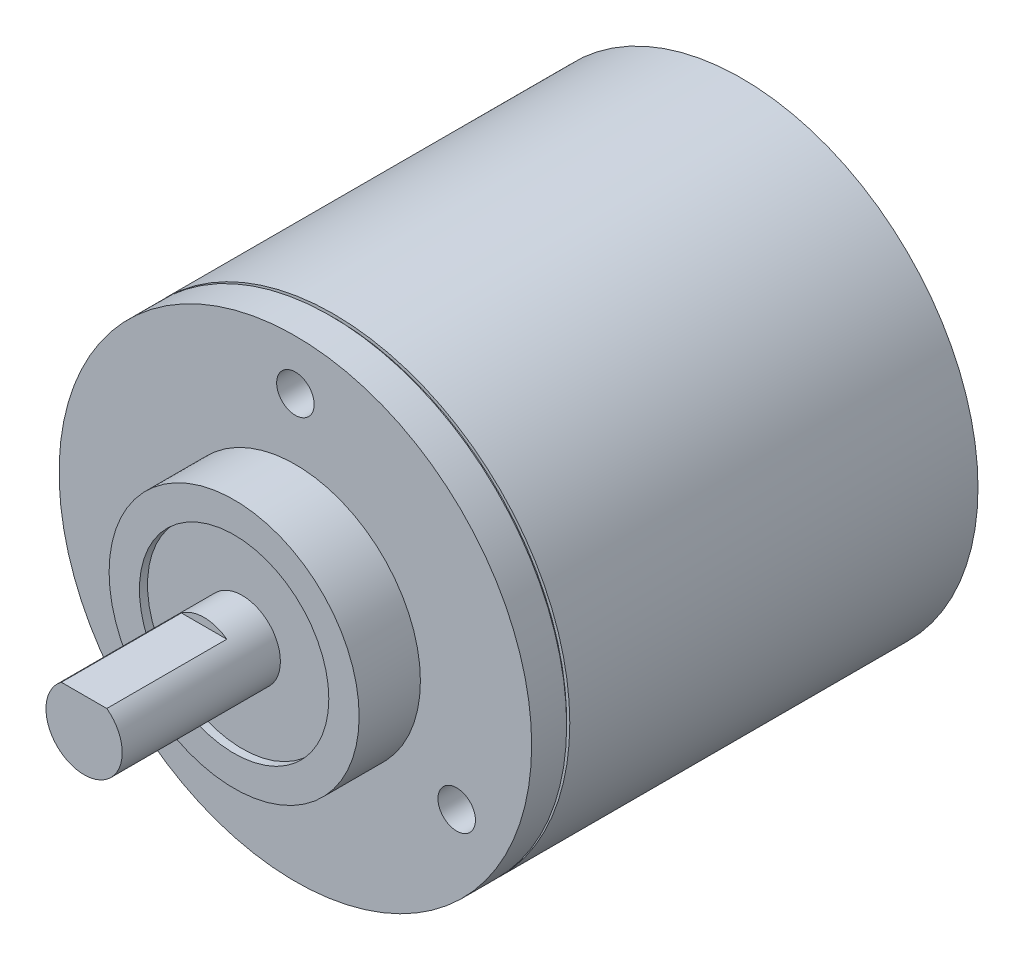
ISO-10303-21;
HEADER;
FILE_DESCRIPTION(('STEP AP214'),'2;1');
FILE_NAME('part.step','',(''),(''),'','','');
FILE_SCHEMA(('AUTOMOTIVE_DESIGN { 1 0 10303 214 1 1 1 1 }'));
ENDSEC;
DATA;
#1=APPLICATION_CONTEXT('core data for automotive mechanical design processes');
#2=APPLICATION_PROTOCOL_DEFINITION('international standard','automotive_design',2000,#1);
#3=PRODUCT_CONTEXT('',#1,'mechanical');
#4=PRODUCT('Part','Part','',(#3));
#5=PRODUCT_RELATED_PRODUCT_CATEGORY('part','',(#4));
#6=PRODUCT_DEFINITION_FORMATION('','',#4);
#7=PRODUCT_DEFINITION_CONTEXT('part definition',#1,'design');
#8=PRODUCT_DEFINITION('design','',#6,#7);
#9=PRODUCT_DEFINITION_SHAPE('','',#8);
#10=(LENGTH_UNIT() NAMED_UNIT(*) SI_UNIT(.MILLI.,.METRE.));
#11=(NAMED_UNIT(*) PLANE_ANGLE_UNIT() SI_UNIT($,.RADIAN.));
#12=(NAMED_UNIT(*) SI_UNIT($,.STERADIAN.) SOLID_ANGLE_UNIT());
#13=UNCERTAINTY_MEASURE_WITH_UNIT(LENGTH_MEASURE(1.E-05),#10,'distance_accuracy_value','');
#14=(GEOMETRIC_REPRESENTATION_CONTEXT(3) GLOBAL_UNCERTAINTY_ASSIGNED_CONTEXT((#13)) GLOBAL_UNIT_ASSIGNED_CONTEXT((#10,
#11,#12)) REPRESENTATION_CONTEXT('',''));
#15=CARTESIAN_POINT('',(0.,0.,0.));
#16=DIRECTION('',(0.,0.,1.));
#17=DIRECTION('',(1.,0.,0.));
#18=AXIS2_PLACEMENT_3D('',#15,#16,#17);
#19=CARTESIAN_POINT('',(0.,0.,-0.0999999999999994));
#20=DIRECTION('',(0.,0.,1.));
#21=DIRECTION('',(1.,0.,0.));
#22=AXIS2_PLACEMENT_3D('',#19,#20,#21);
#23=CYLINDRICAL_SURFACE('',#22,18.9);
#24=CARTESIAN_POINT('',(0.,0.,32.8));
#25=DIRECTION('',(0.,0.,1.));
#26=DIRECTION('',(1.,0.,0.));
#27=AXIS2_PLACEMENT_3D('',#24,#25,#26);
#28=CIRCLE('',#27,18.9);
#29=CARTESIAN_POINT('',(18.9000000000001,0.,32.8));
#30=VERTEX_POINT('',#29);
#31=EDGE_CURVE('E38',#30,#30,#28,.F.);
#32=ORIENTED_EDGE('',*,*,#31,.F.);
#33=EDGE_LOOP('',(#32));
#34=FACE_BOUND('',#33,.T.);
#35=CARTESIAN_POINT('',(0.,0.,35.6));
#36=DIRECTION('',(0.,0.,1.));
#37=DIRECTION('',(1.,0.,0.));
#38=AXIS2_PLACEMENT_3D('',#35,#36,#37);
#39=CIRCLE('',#38,18.9);
#40=CARTESIAN_POINT('',(18.9000000000001,0.,35.6));
#41=VERTEX_POINT('',#40);
#42=EDGE_CURVE('E79',#41,#41,#39,.T.);
#43=ORIENTED_EDGE('',*,*,#42,.F.);
#44=EDGE_LOOP('',(#43));
#45=FACE_BOUND('',#44,.T.);
#46=ADVANCED_FACE('F34',(#34,#45),#23,.T.);
#47=CARTESIAN_POINT('',(0.,0.,35.6));
#48=DIRECTION('',(0.,0.,1.));
#49=DIRECTION('',(1.,0.,0.));
#50=AXIS2_PLACEMENT_3D('',#47,#48,#49);
#51=PLANE('',#50);
#52=CARTESIAN_POINT('',(-12.9037785163882,-7.4500000000001,35.6));
#53=DIRECTION('',(0.,0.,1.));
#54=DIRECTION('',(-0.500000000000006,0.866025403784439,0.));
#55=AXIS2_PLACEMENT_3D('',#52,#53,#54);
#56=CIRCLE('',#55,1.5);
#57=CARTESIAN_POINT('',(-13.6537785163882,-6.15096189432344,35.6));
#58=VERTEX_POINT('',#57);
#59=EDGE_CURVE('E112',#58,#58,#56,.T.);
#60=ORIENTED_EDGE('',*,*,#59,.F.);
#61=EDGE_LOOP('',(#60));
#62=FACE_BOUND('',#61,.T.);
#63=CARTESIAN_POINT('',(12.9037785163882,-7.44999999999988,35.6));
#64=DIRECTION('',(0.,0.,1.));
#65=DIRECTION('',(-0.499999999999994,-0.866025403784446,0.));
#66=AXIS2_PLACEMENT_3D('',#63,#64,#65);
#67=CIRCLE('',#66,1.5);
#68=CARTESIAN_POINT('',(12.1537785163882,-8.74903810567655,35.6));
#69=VERTEX_POINT('',#68);
#70=EDGE_CURVE('E101',#69,#69,#67,.T.);
#71=ORIENTED_EDGE('',*,*,#70,.F.);
#72=EDGE_LOOP('',(#71));
#73=FACE_BOUND('',#72,.T.);
#74=CARTESIAN_POINT('',(0.,14.9000000000001,35.6));
#75=DIRECTION('',(0.,0.,1.));
#76=DIRECTION('',(1.,0.,0.));
#77=AXIS2_PLACEMENT_3D('',#74,#75,#76);
#78=CIRCLE('',#77,1.5);
#79=CARTESIAN_POINT('',(1.50000000000003,14.9000000000001,35.6));
#80=VERTEX_POINT('',#79);
#81=EDGE_CURVE('E82',#80,#80,#78,.T.);
#82=ORIENTED_EDGE('',*,*,#81,.F.);
#83=EDGE_LOOP('',(#82));
#84=FACE_BOUND('',#83,.T.);
#85=CARTESIAN_POINT('',(0.,0.,35.6));
#86=DIRECTION('',(0.,0.,1.));
#87=DIRECTION('',(1.,0.,0.));
#88=AXIS2_PLACEMENT_3D('',#85,#86,#87);
#89=CIRCLE('',#88,10.);
#90=CARTESIAN_POINT('',(10.,0.,35.6));
#91=VERTEX_POINT('',#90);
#92=EDGE_CURVE('E86',#91,#91,#89,.T.);
#93=ORIENTED_EDGE('',*,*,#92,.F.);
#94=EDGE_LOOP('',(#93));
#95=FACE_BOUND('',#94,.T.);
#96=ORIENTED_EDGE('',*,*,#42,.T.);
#97=EDGE_LOOP('',(#96));
#98=FACE_BOUND('',#97,.T.);
#99=ADVANCED_FACE('F143',(#62,#73,#84,#95,#98),#51,.T.);
#100=CARTESIAN_POINT('',(0.,0.,40.5));
#101=DIRECTION('',(0.,0.,-1.));
#102=DIRECTION('',(-1.,0.,0.));
#103=AXIS2_PLACEMENT_3D('',#100,#101,#102);
#104=CYLINDRICAL_SURFACE('',#103,10.);
#105=CARTESIAN_POINT('',(0.,0.,40.5));
#106=DIRECTION('',(0.,0.,1.));
#107=DIRECTION('',(1.,0.,0.));
#108=AXIS2_PLACEMENT_3D('',#105,#106,#107);
#109=CIRCLE('',#108,10.);
#110=CARTESIAN_POINT('',(10.,0.,40.5));
#111=VERTEX_POINT('',#110);
#112=EDGE_CURVE('E75',#111,#111,#109,.T.);
#113=ORIENTED_EDGE('',*,*,#112,.F.);
#114=EDGE_LOOP('',(#113));
#115=FACE_BOUND('',#114,.T.);
#116=ORIENTED_EDGE('',*,*,#92,.T.);
#117=EDGE_LOOP('',(#116));
#118=FACE_BOUND('',#117,.T.);
#119=ADVANCED_FACE('F137',(#115,#118),#104,.T.);
#120=CARTESIAN_POINT('',(0.,0.,40.5));
#121=DIRECTION('',(0.,0.,1.));
#122=DIRECTION('',(1.,0.,0.));
#123=AXIS2_PLACEMENT_3D('',#120,#121,#122);
#124=PLANE('',#123);
#125=CARTESIAN_POINT('',(0.,0.,40.5));
#126=DIRECTION('',(0.,0.,1.));
#127=DIRECTION('',(1.,0.,0.));
#128=AXIS2_PLACEMENT_3D('',#125,#126,#127);
#129=CIRCLE('',#128,7.575);
#130=CARTESIAN_POINT('',(7.57500000000003,0.,40.5));
#131=VERTEX_POINT('',#130);
#132=EDGE_CURVE('E124',#131,#131,#129,.T.);
#133=ORIENTED_EDGE('',*,*,#132,.F.);
#134=EDGE_LOOP('',(#133));
#135=FACE_BOUND('',#134,.T.);
#136=ORIENTED_EDGE('',*,*,#112,.T.);
#137=EDGE_LOOP('',(#136));
#138=FACE_BOUND('',#137,.T.);
#139=ADVANCED_FACE('F133',(#135,#138),#124,.T.);
#140=CARTESIAN_POINT('',(0.,14.9000000000001,27.6));
#141=DIRECTION('',(0.,0.,1.));
#142=DIRECTION('',(1.,0.,0.));
#143=AXIS2_PLACEMENT_3D('',#140,#141,#142);
#144=CYLINDRICAL_SURFACE('',#143,1.5);
#145=CARTESIAN_POINT('',(0.,14.9000000000001,27.6));
#146=DIRECTION('',(0.,0.,1.));
#147=DIRECTION('',(1.,0.,0.));
#148=AXIS2_PLACEMENT_3D('',#145,#146,#147);
#149=CIRCLE('',#148,1.5);
#150=CARTESIAN_POINT('',(1.50000000000003,14.9000000000001,27.6));
#151=VERTEX_POINT('',#150);
#152=EDGE_CURVE('E76',#151,#151,#149,.T.);
#153=ORIENTED_EDGE('',*,*,#152,.F.);
#154=EDGE_LOOP('',(#153));
#155=FACE_BOUND('',#154,.T.);
#156=ORIENTED_EDGE('',*,*,#81,.T.);
#157=EDGE_LOOP('',(#156));
#158=FACE_BOUND('',#157,.T.);
#159=ADVANCED_FACE('F136',(#155,#158),#144,.F.);
#160=CARTESIAN_POINT('',(0.,14.9000000000001,27.6));
#161=DIRECTION('',(0.,0.,1.));
#162=DIRECTION('',(1.,0.,0.));
#163=AXIS2_PLACEMENT_3D('',#160,#161,#162);
#164=PLANE('',#163);
#165=ORIENTED_EDGE('',*,*,#152,.T.);
#166=EDGE_LOOP('',(#165));
#167=FACE_BOUND('',#166,.T.);
#168=ADVANCED_FACE('F181',(#167),#164,.T.);
#169=CARTESIAN_POINT('',(0.,0.,39.85));
#170=DIRECTION('',(0.,0.,1.));
#171=DIRECTION('',(1.,0.,0.));
#172=AXIS2_PLACEMENT_3D('',#169,#170,#171);
#173=CYLINDRICAL_SURFACE('',#172,7.575);
#174=CARTESIAN_POINT('',(0.,0.,39.85));
#175=DIRECTION('',(0.,0.,1.));
#176=DIRECTION('',(1.,0.,0.));
#177=AXIS2_PLACEMENT_3D('',#174,#175,#176);
#178=CIRCLE('',#177,7.575);
#179=CARTESIAN_POINT('',(7.57500000000003,0.,39.85));
#180=VERTEX_POINT('',#179);
#181=EDGE_CURVE('E125',#180,#180,#178,.T.);
#182=ORIENTED_EDGE('',*,*,#181,.F.);
#183=EDGE_LOOP('',(#182));
#184=FACE_BOUND('',#183,.T.);
#185=ORIENTED_EDGE('',*,*,#132,.T.);
#186=EDGE_LOOP('',(#185));
#187=FACE_BOUND('',#186,.T.);
#188=ADVANCED_FACE('F131',(#184,#187),#173,.F.);
#189=CARTESIAN_POINT('',(0.,0.,39.85));
#190=DIRECTION('',(0.,0.,1.));
#191=DIRECTION('',(1.,0.,0.));
#192=AXIS2_PLACEMENT_3D('',#189,#190,#191);
#193=PLANE('',#192);
#194=CARTESIAN_POINT('',(0.,0.,39.85));
#195=DIRECTION('',(0.,0.,1.));
#196=DIRECTION('',(1.,0.,0.));
#197=AXIS2_PLACEMENT_3D('',#194,#195,#196);
#198=CIRCLE('',#197,3.05);
#199=CARTESIAN_POINT('',(3.05000000000001,0.,39.85));
#200=VERTEX_POINT('',#199);
#201=EDGE_CURVE('E120',#200,#200,#198,.T.);
#202=ORIENTED_EDGE('',*,*,#201,.F.);
#203=EDGE_LOOP('',(#202));
#204=FACE_BOUND('',#203,.T.);
#205=ORIENTED_EDGE('',*,*,#181,.T.);
#206=EDGE_LOOP('',(#205));
#207=FACE_BOUND('',#206,.T.);
#208=ADVANCED_FACE('F178',(#204,#207),#193,.T.);
#209=CARTESIAN_POINT('',(0.,0.,52.5));
#210=DIRECTION('',(0.,0.,1.));
#211=DIRECTION('',(1.,0.,0.));
#212=AXIS2_PLACEMENT_3D('',#209,#210,#211);
#213=PLANE('',#212);
#214=DIRECTION('',(1.,0.,0.));
#215=VECTOR('',#214,1.);
#216=CARTESIAN_POINT('',(-4.31706966346978,2.45,52.5));
#217=LINE('',#216,#215);
#218=CARTESIAN_POINT('',(-1.8165902124585,2.44999999999997,52.5));
#219=VERTEX_POINT('',#218);
#220=CARTESIAN_POINT('',(1.8165902124585,2.45,52.5));
#221=VERTEX_POINT('',#220);
#222=EDGE_CURVE('E63',#219,#221,#217,.T.);
#223=ORIENTED_EDGE('',*,*,#222,.F.);
#224=CARTESIAN_POINT('',(0.,0.,52.5));
#225=DIRECTION('',(0.,0.,1.));
#226=DIRECTION('',(1.,0.,0.));
#227=AXIS2_PLACEMENT_3D('',#224,#225,#226);
#228=CIRCLE('',#227,3.05);
#229=EDGE_CURVE('E70',#219,#221,#228,.T.);
#230=ORIENTED_EDGE('',*,*,#229,.T.);
#231=EDGE_LOOP('',(#223,#230));
#232=FACE_BOUND('',#231,.T.);
#233=ADVANCED_FACE('F69',(#232),#213,.T.);
#234=CARTESIAN_POINT('',(0.,0.,52.5));
#235=DIRECTION('',(0.,0.,-1.));
#236=DIRECTION('',(-1.,0.,0.));
#237=AXIS2_PLACEMENT_3D('',#234,#235,#236);
#238=CYLINDRICAL_SURFACE('',#237,3.05);
#239=ORIENTED_EDGE('',*,*,#229,.F.);
#240=DIRECTION('',(0.,0.,-1.));
#241=VECTOR('',#240,1.);
#242=CARTESIAN_POINT('',(-1.8165902124585,2.44999999999997,52.5));
#243=LINE('',#242,#241);
#244=CARTESIAN_POINT('',(-1.8165902124585,2.45,42.9));
#245=VERTEX_POINT('',#244);
#246=EDGE_CURVE('E11',#219,#245,#243,.T.);
#247=ORIENTED_EDGE('',*,*,#246,.T.);
#248=CARTESIAN_POINT('',(0.,0.,42.9));
#249=DIRECTION('',(0.,0.,1.));
#250=DIRECTION('',(1.,0.,0.));
#251=AXIS2_PLACEMENT_3D('',#248,#249,#250);
#252=CIRCLE('',#251,3.05);
#253=CARTESIAN_POINT('',(1.81659021245856,2.45000000000001,42.9));
#254=VERTEX_POINT('',#253);
#255=EDGE_CURVE('E54',#254,#245,#252,.T.);
#256=ORIENTED_EDGE('',*,*,#255,.F.);
#257=DIRECTION('',(0.,0.,-1.));
#258=VECTOR('',#257,1.);
#259=CARTESIAN_POINT('',(1.8165902124585,2.45,52.5));
#260=LINE('',#259,#258);
#261=EDGE_CURVE('E43',#254,#221,#260,.F.);
#262=ORIENTED_EDGE('',*,*,#261,.T.);
#263=EDGE_LOOP('',(#239,#247,#256,#262));
#264=FACE_BOUND('',#263,.T.);
#265=ORIENTED_EDGE('',*,*,#201,.T.);
#266=EDGE_LOOP('',(#265));
#267=FACE_BOUND('',#266,.T.);
#268=ADVANCED_FACE('F73',(#264,#267),#238,.T.);
#269=CARTESIAN_POINT('',(-4.31706966346971,2.45,42.9));
#270=DIRECTION('',(0.,-1.,0.));
#271=DIRECTION('',(0.,0.,-1.));
#272=AXIS2_PLACEMENT_3D('',#269,#270,#271);
#273=PLANE('',#272);
#274=ORIENTED_EDGE('',*,*,#222,.T.);
#275=ORIENTED_EDGE('',*,*,#261,.F.);
#276=DIRECTION('',(1.,0.,0.));
#277=VECTOR('',#276,1.);
#278=CARTESIAN_POINT('',(-4.31706966346971,2.45,42.9));
#279=LINE('',#278,#277);
#280=EDGE_CURVE('E50',#245,#254,#279,.T.);
#281=ORIENTED_EDGE('',*,*,#280,.F.);
#282=ORIENTED_EDGE('',*,*,#246,.F.);
#283=EDGE_LOOP('',(#274,#275,#281,#282));
#284=FACE_BOUND('',#283,.T.);
#285=ADVANCED_FACE('F62',(#284),#273,.F.);
#286=CARTESIAN_POINT('',(0.,0.,42.9));
#287=DIRECTION('',(0.,0.,1.));
#288=DIRECTION('',(1.,0.,0.));
#289=AXIS2_PLACEMENT_3D('',#286,#287,#288);
#290=PLANE('',#289);
#291=ORIENTED_EDGE('',*,*,#255,.T.);
#292=ORIENTED_EDGE('',*,*,#280,.T.);
#293=EDGE_LOOP('',(#291,#292));
#294=FACE_BOUND('',#293,.T.);
#295=ADVANCED_FACE('F194',(#294),#290,.T.);
#296=CARTESIAN_POINT('',(12.9037785163882,-7.44999999999988,27.6));
#297=DIRECTION('',(0.,0.,1.));
#298=DIRECTION('',(1.,0.,0.));
#299=AXIS2_PLACEMENT_3D('',#296,#297,#298);
#300=CYLINDRICAL_SURFACE('',#299,1.5);
#301=CARTESIAN_POINT('',(12.9037785163882,-7.44999999999988,27.6));
#302=DIRECTION('',(0.,0.,1.));
#303=DIRECTION('',(-0.499999999999994,-0.866025403784446,0.));
#304=AXIS2_PLACEMENT_3D('',#301,#302,#303);
#305=CIRCLE('',#304,1.5);
#306=CARTESIAN_POINT('',(12.1537785163882,-8.74903810567655,27.6));
#307=VERTEX_POINT('',#306);
#308=EDGE_CURVE('E115',#307,#307,#305,.T.);
#309=ORIENTED_EDGE('',*,*,#308,.F.);
#310=EDGE_LOOP('',(#309));
#311=FACE_BOUND('',#310,.T.);
#312=ORIENTED_EDGE('',*,*,#70,.T.);
#313=EDGE_LOOP('',(#312));
#314=FACE_BOUND('',#313,.T.);
#315=ADVANCED_FACE('F197',(#311,#314),#300,.F.);
#316=CARTESIAN_POINT('',(12.9037785163882,-7.44999999999988,27.6));
#317=DIRECTION('',(0.,0.,1.));
#318=DIRECTION('',(-0.499999999999994,-0.866025403784446,0.));
#319=AXIS2_PLACEMENT_3D('',#316,#317,#318);
#320=PLANE('',#319);
#321=ORIENTED_EDGE('',*,*,#308,.T.);
#322=EDGE_LOOP('',(#321));
#323=FACE_BOUND('',#322,.T.);
#324=ADVANCED_FACE('F200',(#323),#320,.T.);
#325=CARTESIAN_POINT('',(-12.9037785163882,-7.45000000000006,27.6));
#326=DIRECTION('',(0.,0.,1.));
#327=DIRECTION('',(1.,0.,0.));
#328=AXIS2_PLACEMENT_3D('',#325,#326,#327);
#329=CYLINDRICAL_SURFACE('',#328,1.5);
#330=CARTESIAN_POINT('',(-12.9037785163882,-7.45000000000006,27.6));
#331=DIRECTION('',(0.,0.,1.));
#332=DIRECTION('',(-0.500000000000006,0.866025403784439,0.));
#333=AXIS2_PLACEMENT_3D('',#330,#331,#332);
#334=CIRCLE('',#333,1.5);
#335=CARTESIAN_POINT('',(-13.6537785163882,-6.1509618943234,27.6));
#336=VERTEX_POINT('',#335);
#337=EDGE_CURVE('E71',#336,#336,#334,.T.);
#338=ORIENTED_EDGE('',*,*,#337,.F.);
#339=EDGE_LOOP('',(#338));
#340=FACE_BOUND('',#339,.T.);
#341=ORIENTED_EDGE('',*,*,#59,.T.);
#342=EDGE_LOOP('',(#341));
#343=FACE_BOUND('',#342,.T.);
#344=ADVANCED_FACE('F204',(#340,#343),#329,.F.);
#345=CARTESIAN_POINT('',(-12.9037785163882,-7.45000000000006,27.6));
#346=DIRECTION('',(0.,0.,1.));
#347=DIRECTION('',(-0.500000000000006,0.866025403784439,0.));
#348=AXIS2_PLACEMENT_3D('',#345,#346,#347);
#349=PLANE('',#348);
#350=ORIENTED_EDGE('',*,*,#337,.T.);
#351=EDGE_LOOP('',(#350));
#352=FACE_BOUND('',#351,.T.);
#353=ADVANCED_FACE('F208',(#352),#349,.T.);
#354=CARTESIAN_POINT('',(0.,21.8461649379908,32.8));
#355=DIRECTION('',(0.,0.,1.));
#356=DIRECTION('',(1.,0.,0.));
#357=AXIS2_PLACEMENT_3D('',#354,#355,#356);
#358=PLANE('',#357);
#359=ORIENTED_EDGE('',*,*,#31,.T.);
#360=EDGE_LOOP('',(#359));
#361=FACE_BOUND('',#360,.T.);
#362=CARTESIAN_POINT('',(0.,0.,32.8));
#363=DIRECTION('',(0.,0.,-1.));
#364=DIRECTION('',(-1.,0.,0.));
#365=AXIS2_PLACEMENT_3D('',#362,#363,#364);
#366=CIRCLE('',#365,18.65);
#367=CARTESIAN_POINT('',(-18.6500000000001,0.,32.8));
#368=VERTEX_POINT('',#367);
#369=EDGE_CURVE('E97',#368,#368,#366,.T.);
#370=ORIENTED_EDGE('',*,*,#369,.F.);
#371=EDGE_LOOP('',(#370));
#372=FACE_BOUND('',#371,.T.);
#373=ADVANCED_FACE('F212',(#361,#372),#358,.F.);
#374=CARTESIAN_POINT('',(0.,0.,-0.0999999999999994));
#375=DIRECTION('',(0.,0.,-1.));
#376=DIRECTION('',(-1.,0.,0.));
#377=AXIS2_PLACEMENT_3D('',#374,#375,#376);
#378=CYLINDRICAL_SURFACE('',#377,18.65);
#379=CARTESIAN_POINT('',(0.,0.,32.55));
#380=DIRECTION('',(0.,0.,-1.));
#381=DIRECTION('',(-1.,0.,0.));
#382=AXIS2_PLACEMENT_3D('',#379,#380,#381);
#383=CIRCLE('',#382,18.65);
#384=CARTESIAN_POINT('',(-18.6500000000001,0.,32.55));
#385=VERTEX_POINT('',#384);
#386=EDGE_CURVE('E103',#385,#385,#383,.T.);
#387=ORIENTED_EDGE('',*,*,#386,.F.);
#388=EDGE_LOOP('',(#387));
#389=FACE_BOUND('',#388,.T.);
#390=ORIENTED_EDGE('',*,*,#369,.T.);
#391=EDGE_LOOP('',(#390));
#392=FACE_BOUND('',#391,.T.);
#393=ADVANCED_FACE('F171',(#389,#392),#378,.T.);
#394=CARTESIAN_POINT('',(0.,21.8461649379908,32.55));
#395=DIRECTION('',(0.,0.,-1.));
#396=DIRECTION('',(-1.,0.,0.));
#397=AXIS2_PLACEMENT_3D('',#394,#395,#396);
#398=PLANE('',#397);
#399=CARTESIAN_POINT('',(0.,0.,32.55));
#400=DIRECTION('',(0.,0.,-1.));
#401=DIRECTION('',(-1.,0.,0.));
#402=AXIS2_PLACEMENT_3D('',#399,#400,#401);
#403=CIRCLE('',#402,18.9);
#404=CARTESIAN_POINT('',(-18.9000000000001,0.,32.55));
#405=VERTEX_POINT('',#404);
#406=EDGE_CURVE('E95',#405,#405,#403,.F.);
#407=ORIENTED_EDGE('',*,*,#406,.T.);
#408=EDGE_LOOP('',(#407));
#409=FACE_BOUND('',#408,.T.);
#410=ORIENTED_EDGE('',*,*,#386,.T.);
#411=EDGE_LOOP('',(#410));
#412=FACE_BOUND('',#411,.T.);
#413=ADVANCED_FACE('F164',(#409,#412),#398,.F.);
#414=CARTESIAN_POINT('',(0.,0.,-0.0999999999999994));
#415=DIRECTION('',(0.,0.,1.));
#416=DIRECTION('',(1.,0.,0.));
#417=AXIS2_PLACEMENT_3D('',#414,#415,#416);
#418=PLANE('',#417);
#419=CARTESIAN_POINT('',(0.,0.,-0.0999999999999994));
#420=DIRECTION('',(0.,0.,1.));
#421=DIRECTION('',(1.,0.,0.));
#422=AXIS2_PLACEMENT_3D('',#419,#420,#421);
#423=CIRCLE('',#422,18.9);
#424=CARTESIAN_POINT('',(18.9000000000001,0.,-0.0999999999999994));
#425=VERTEX_POINT('',#424);
#426=EDGE_CURVE('E89',#425,#425,#423,.T.);
#427=ORIENTED_EDGE('',*,*,#426,.F.);
#428=EDGE_LOOP('',(#427));
#429=FACE_BOUND('',#428,.T.);
#430=ADVANCED_FACE('F159',(#429),#418,.F.);
#431=ORIENTED_EDGE('',*,*,#406,.F.);
#432=EDGE_LOOP('',(#431));
#433=FACE_BOUND('',#432,.T.);
#434=ORIENTED_EDGE('',*,*,#426,.T.);
#435=EDGE_LOOP('',(#434));
#436=FACE_BOUND('',#435,.T.);
#437=ADVANCED_FACE('F36',(#433,#436),#23,.T.);
#438=CLOSED_SHELL('',(#46,#99,#119,#139,#159,#168,#188,#208,#233,#268,#285,#295,#315,#324,#344,
#353,#373,#393,#413,#430,#437));
#439=MANIFOLD_SOLID_BREP('B2',#438);
#440=ADVANCED_BREP_SHAPE_REPRESENTATION('',(#18,#439),#14);
#441=SHAPE_DEFINITION_REPRESENTATION(#9,#440);
ENDSEC;
END-ISO-10303-21;
